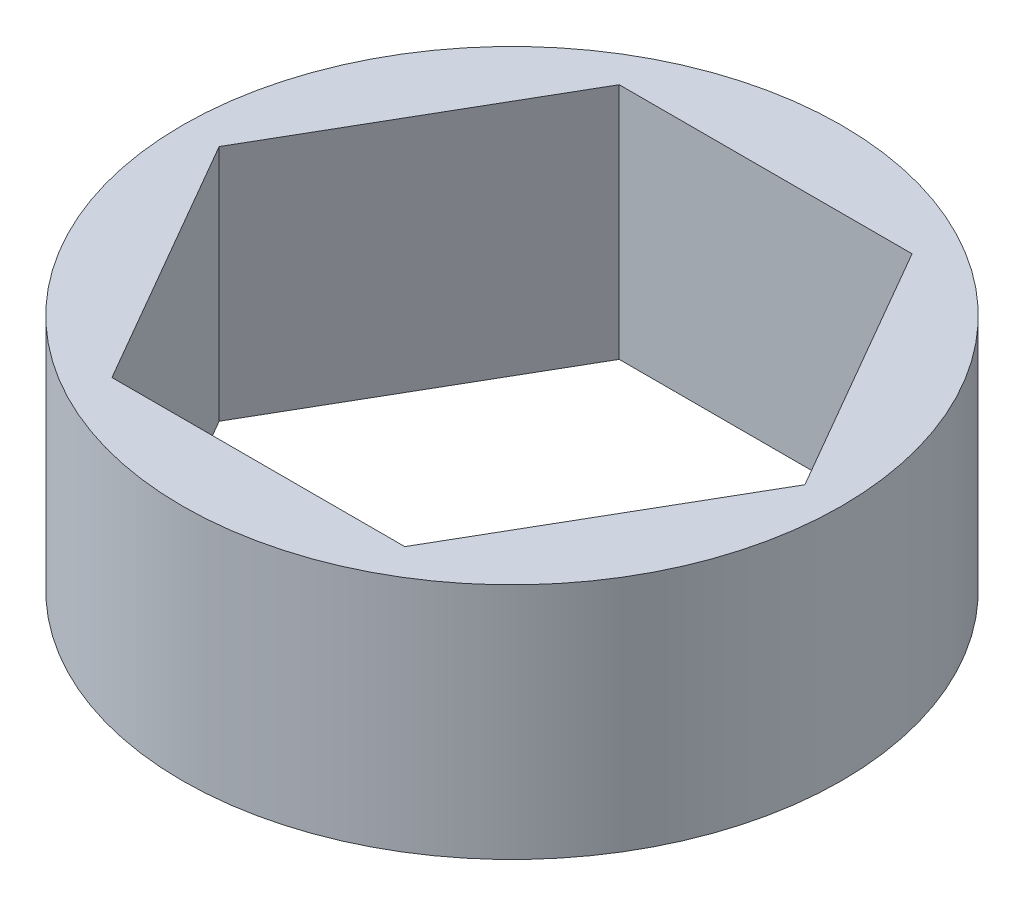
ISO-10303-21;
HEADER;
FILE_DESCRIPTION(('STEP AP214'),'2;1');
FILE_NAME('part.step','',(''),(''),'','','');
FILE_SCHEMA(('AUTOMOTIVE_DESIGN { 1 0 10303 214 1 1 1 1 }'));
ENDSEC;
DATA;
#1=APPLICATION_CONTEXT('core data for automotive mechanical design processes');
#2=APPLICATION_PROTOCOL_DEFINITION('international standard','automotive_design',2000,#1);
#3=PRODUCT_CONTEXT('',#1,'mechanical');
#4=PRODUCT('Part','Part','',(#3));
#5=PRODUCT_RELATED_PRODUCT_CATEGORY('part','',(#4));
#6=PRODUCT_DEFINITION_FORMATION('','',#4);
#7=PRODUCT_DEFINITION_CONTEXT('part definition',#1,'design');
#8=PRODUCT_DEFINITION('design','',#6,#7);
#9=PRODUCT_DEFINITION_SHAPE('','',#8);
#10=(LENGTH_UNIT() NAMED_UNIT(*) SI_UNIT(.MILLI.,.METRE.));
#11=(NAMED_UNIT(*) PLANE_ANGLE_UNIT() SI_UNIT($,.RADIAN.));
#12=(NAMED_UNIT(*) SI_UNIT($,.STERADIAN.) SOLID_ANGLE_UNIT());
#13=UNCERTAINTY_MEASURE_WITH_UNIT(LENGTH_MEASURE(1.E-05),#10,'distance_accuracy_value','');
#14=(GEOMETRIC_REPRESENTATION_CONTEXT(3) GLOBAL_UNCERTAINTY_ASSIGNED_CONTEXT((#13)) GLOBAL_UNIT_ASSIGNED_CONTEXT((#10,
#11,#12)) REPRESENTATION_CONTEXT('',''));
#15=CARTESIAN_POINT('',(0.,0.,0.));
#16=DIRECTION('',(0.,0.,1.));
#17=DIRECTION('',(1.,0.,0.));
#18=AXIS2_PLACEMENT_3D('',#15,#16,#17);
#19=CARTESIAN_POINT('',(0.,5.9563,0.));
#20=DIRECTION('',(0.,1.,0.));
#21=DIRECTION('',(0.,0.,1.));
#22=AXIS2_PLACEMENT_3D('',#19,#20,#21);
#23=PLANE('',#22);
#24=CARTESIAN_POINT('',(0.,5.9563,0.));
#25=DIRECTION('',(0.,1.,0.));
#26=DIRECTION('',(0.,0.,1.));
#27=AXIS2_PLACEMENT_3D('',#24,#25,#26);
#28=CIRCLE('',#27,8.255);
#29=CARTESIAN_POINT('',(0.,5.9563,8.255));
#30=VERTEX_POINT('',#29);
#31=EDGE_CURVE('E11',#30,#30,#28,.T.);
#32=ORIENTED_EDGE('',*,*,#31,.T.);
#33=EDGE_LOOP('',(#32));
#34=FACE_BOUND('',#33,.T.);
#35=DIRECTION('',(-0.5,0.,-0.866025403784439));
#36=VECTOR('',#35,1.);
#37=CARTESIAN_POINT('',(7.33234841870825,5.9563,0.));
#38=LINE('',#37,#36);
#39=CARTESIAN_POINT('',(7.33234841870825,5.9563,0.));
#40=VERTEX_POINT('',#39);
#41=CARTESIAN_POINT('',(3.66617420935412,5.9563,-6.35));
#42=VERTEX_POINT('',#41);
#43=EDGE_CURVE('E112',#40,#42,#38,.T.);
#44=ORIENTED_EDGE('',*,*,#43,.F.);
#45=DIRECTION('',(0.5,0.,-0.866025403784439));
#46=VECTOR('',#45,1.);
#47=CARTESIAN_POINT('',(3.66617420935413,5.9563,6.35));
#48=LINE('',#47,#46);
#49=CARTESIAN_POINT('',(3.66617420935413,5.9563,6.35));
#50=VERTEX_POINT('',#49);
#51=EDGE_CURVE('E103',#50,#40,#48,.T.);
#52=ORIENTED_EDGE('',*,*,#51,.F.);
#53=DIRECTION('',(1.,0.,0.));
#54=VECTOR('',#53,1.);
#55=CARTESIAN_POINT('',(-3.66617420935412,5.9563,6.35));
#56=LINE('',#55,#54);
#57=CARTESIAN_POINT('',(-3.66617420935412,5.9563,6.35));
#58=VERTEX_POINT('',#57);
#59=EDGE_CURVE('E137',#58,#50,#56,.T.);
#60=ORIENTED_EDGE('',*,*,#59,.F.);
#61=DIRECTION('',(0.5,0.,0.866025403784438));
#62=VECTOR('',#61,1.);
#63=CARTESIAN_POINT('',(-7.33234841870825,5.9563,0.));
#64=LINE('',#63,#62);
#65=CARTESIAN_POINT('',(-7.33234841870825,5.9563,0.));
#66=VERTEX_POINT('',#65);
#67=EDGE_CURVE('E134',#66,#58,#64,.T.);
#68=ORIENTED_EDGE('',*,*,#67,.F.);
#69=DIRECTION('',(-0.5,0.,0.866025403784439));
#70=VECTOR('',#69,1.);
#71=CARTESIAN_POINT('',(-3.66617420935412,5.9563,-6.35));
#72=LINE('',#71,#70);
#73=CARTESIAN_POINT('',(-3.66617420935412,5.9563,-6.35));
#74=VERTEX_POINT('',#73);
#75=EDGE_CURVE('E129',#74,#66,#72,.T.);
#76=ORIENTED_EDGE('',*,*,#75,.F.);
#77=DIRECTION('',(-1.,0.,0.));
#78=VECTOR('',#77,1.);
#79=CARTESIAN_POINT('',(3.66617420935412,5.9563,-6.35));
#80=LINE('',#79,#78);
#81=EDGE_CURVE('E125',#42,#74,#80,.T.);
#82=ORIENTED_EDGE('',*,*,#81,.F.);
#83=EDGE_LOOP('',(#44,#52,#60,#68,#76,#82));
#84=FACE_BOUND('',#83,.T.);
#85=ADVANCED_FACE('F49',(#34,#84),#23,.T.);
#86=CARTESIAN_POINT('',(0.,0.,0.));
#87=DIRECTION('',(0.,1.,0.));
#88=DIRECTION('',(0.,0.,1.));
#89=AXIS2_PLACEMENT_3D('',#86,#87,#88);
#90=PLANE('',#89);
#91=CARTESIAN_POINT('',(0.,0.,0.));
#92=DIRECTION('',(0.,1.,0.));
#93=DIRECTION('',(0.,0.,1.));
#94=AXIS2_PLACEMENT_3D('',#91,#92,#93);
#95=CIRCLE('',#94,8.255);
#96=CARTESIAN_POINT('',(0.,0.,8.255));
#97=VERTEX_POINT('',#96);
#98=EDGE_CURVE('E53',#97,#97,#95,.T.);
#99=ORIENTED_EDGE('',*,*,#98,.F.);
#100=EDGE_LOOP('',(#99));
#101=FACE_BOUND('',#100,.T.);
#102=DIRECTION('',(0.5,0.,-0.866025403784439));
#103=VECTOR('',#102,1.);
#104=CARTESIAN_POINT('',(3.66617420935413,0.,6.35));
#105=LINE('',#104,#103);
#106=CARTESIAN_POINT('',(3.66617420935413,0.,6.35));
#107=VERTEX_POINT('',#106);
#108=CARTESIAN_POINT('',(7.33234841870825,0.,0.));
#109=VERTEX_POINT('',#108);
#110=EDGE_CURVE('E73',#107,#109,#105,.T.);
#111=ORIENTED_EDGE('',*,*,#110,.T.);
#112=DIRECTION('',(-0.5,0.,-0.866025403784439));
#113=VECTOR('',#112,1.);
#114=CARTESIAN_POINT('',(7.33234841870825,0.,0.));
#115=LINE('',#114,#113);
#116=CARTESIAN_POINT('',(3.66617420935412,0.,-6.35));
#117=VERTEX_POINT('',#116);
#118=EDGE_CURVE('E119',#109,#117,#115,.T.);
#119=ORIENTED_EDGE('',*,*,#118,.T.);
#120=DIRECTION('',(-1.,0.,0.));
#121=VECTOR('',#120,1.);
#122=CARTESIAN_POINT('',(3.66617420935412,0.,-6.35));
#123=LINE('',#122,#121);
#124=CARTESIAN_POINT('',(-3.66617420935412,0.,-6.35));
#125=VERTEX_POINT('',#124);
#126=EDGE_CURVE('E144',#117,#125,#123,.T.);
#127=ORIENTED_EDGE('',*,*,#126,.T.);
#128=DIRECTION('',(-0.5,0.,0.866025403784439));
#129=VECTOR('',#128,1.);
#130=CARTESIAN_POINT('',(-3.66617420935412,0.,-6.35));
#131=LINE('',#130,#129);
#132=CARTESIAN_POINT('',(-7.33234841870825,0.,0.));
#133=VERTEX_POINT('',#132);
#134=EDGE_CURVE('E148',#125,#133,#131,.T.);
#135=ORIENTED_EDGE('',*,*,#134,.T.);
#136=DIRECTION('',(0.5,0.,0.866025403784438));
#137=VECTOR('',#136,1.);
#138=CARTESIAN_POINT('',(-7.33234841870825,0.,0.));
#139=LINE('',#138,#137);
#140=CARTESIAN_POINT('',(-3.66617420935412,0.,6.35));
#141=VERTEX_POINT('',#140);
#142=EDGE_CURVE('E152',#133,#141,#139,.T.);
#143=ORIENTED_EDGE('',*,*,#142,.T.);
#144=DIRECTION('',(1.,0.,0.));
#145=VECTOR('',#144,1.);
#146=CARTESIAN_POINT('',(-3.66617420935412,0.,6.35));
#147=LINE('',#146,#145);
#148=EDGE_CURVE('E113',#141,#107,#147,.T.);
#149=ORIENTED_EDGE('',*,*,#148,.T.);
#150=EDGE_LOOP('',(#111,#119,#127,#135,#143,#149));
#151=FACE_BOUND('',#150,.T.);
#152=ADVANCED_FACE('F176',(#101,#151),#90,.F.);
#153=CARTESIAN_POINT('',(0.,5.9563,0.));
#154=DIRECTION('',(0.,-1.,0.));
#155=DIRECTION('',(0.,0.,-1.));
#156=AXIS2_PLACEMENT_3D('',#153,#154,#155);
#157=CYLINDRICAL_SURFACE('',#156,8.255);
#158=ORIENTED_EDGE('',*,*,#31,.F.);
#159=EDGE_LOOP('',(#158));
#160=FACE_BOUND('',#159,.T.);
#161=ORIENTED_EDGE('',*,*,#98,.T.);
#162=EDGE_LOOP('',(#161));
#163=FACE_BOUND('',#162,.T.);
#164=ADVANCED_FACE('F51',(#160,#163),#157,.T.);
#165=CARTESIAN_POINT('',(3.66617420935413,5.9563,6.35));
#166=DIRECTION('',(-0.866025403784439,0.,-0.5));
#167=DIRECTION('',(-0.5,0.,0.866025403784439));
#168=AXIS2_PLACEMENT_3D('',#165,#166,#167);
#169=PLANE('',#168);
#170=ORIENTED_EDGE('',*,*,#110,.F.);
#171=DIRECTION('',(0.,-1.,0.));
#172=VECTOR('',#171,1.);
#173=CARTESIAN_POINT('',(3.66617420935413,5.9563,6.35));
#174=LINE('',#173,#172);
#175=EDGE_CURVE('E107',#50,#107,#174,.T.);
#176=ORIENTED_EDGE('',*,*,#175,.F.);
#177=ORIENTED_EDGE('',*,*,#51,.T.);
#178=DIRECTION('',(0.,-1.,0.));
#179=VECTOR('',#178,1.);
#180=CARTESIAN_POINT('',(7.33234841870825,5.9563,0.));
#181=LINE('',#180,#179);
#182=EDGE_CURVE('E106',#40,#109,#181,.T.);
#183=ORIENTED_EDGE('',*,*,#182,.T.);
#184=EDGE_LOOP('',(#170,#176,#177,#183));
#185=FACE_BOUND('',#184,.T.);
#186=ADVANCED_FACE('F105',(#185),#169,.T.);
#187=CARTESIAN_POINT('',(7.33234841870825,5.9563,0.));
#188=DIRECTION('',(-0.866025403784439,0.,0.5));
#189=DIRECTION('',(0.5,0.,0.866025403784439));
#190=AXIS2_PLACEMENT_3D('',#187,#188,#189);
#191=PLANE('',#190);
#192=ORIENTED_EDGE('',*,*,#118,.F.);
#193=ORIENTED_EDGE('',*,*,#182,.F.);
#194=ORIENTED_EDGE('',*,*,#43,.T.);
#195=DIRECTION('',(0.,-1.,0.));
#196=VECTOR('',#195,1.);
#197=CARTESIAN_POINT('',(3.66617420935412,5.9563,-6.35));
#198=LINE('',#197,#196);
#199=EDGE_CURVE('E121',#42,#117,#198,.T.);
#200=ORIENTED_EDGE('',*,*,#199,.T.);
#201=EDGE_LOOP('',(#192,#193,#194,#200));
#202=FACE_BOUND('',#201,.T.);
#203=ADVANCED_FACE('F116',(#202),#191,.T.);
#204=CARTESIAN_POINT('',(3.66617420935412,5.9563,-6.35));
#205=DIRECTION('',(0.,0.,1.));
#206=DIRECTION('',(1.,0.,0.));
#207=AXIS2_PLACEMENT_3D('',#204,#205,#206);
#208=PLANE('',#207);
#209=ORIENTED_EDGE('',*,*,#126,.F.);
#210=ORIENTED_EDGE('',*,*,#199,.F.);
#211=ORIENTED_EDGE('',*,*,#81,.T.);
#212=DIRECTION('',(0.,-1.,0.));
#213=VECTOR('',#212,1.);
#214=CARTESIAN_POINT('',(-3.66617420935412,5.9563,-6.35));
#215=LINE('',#214,#213);
#216=EDGE_CURVE('E166',#74,#125,#215,.T.);
#217=ORIENTED_EDGE('',*,*,#216,.T.);
#218=EDGE_LOOP('',(#209,#210,#211,#217));
#219=FACE_BOUND('',#218,.T.);
#220=ADVANCED_FACE('F172',(#219),#208,.T.);
#221=CARTESIAN_POINT('',(-3.66617420935412,5.9563,-6.35));
#222=DIRECTION('',(0.866025403784439,0.,0.5));
#223=DIRECTION('',(0.5,0.,-0.866025403784439));
#224=AXIS2_PLACEMENT_3D('',#221,#222,#223);
#225=PLANE('',#224);
#226=ORIENTED_EDGE('',*,*,#134,.F.);
#227=ORIENTED_EDGE('',*,*,#216,.F.);
#228=ORIENTED_EDGE('',*,*,#75,.T.);
#229=DIRECTION('',(0.,-1.,0.));
#230=VECTOR('',#229,1.);
#231=CARTESIAN_POINT('',(-7.33234841870825,5.9563,0.));
#232=LINE('',#231,#230);
#233=EDGE_CURVE('E163',#66,#133,#232,.T.);
#234=ORIENTED_EDGE('',*,*,#233,.T.);
#235=EDGE_LOOP('',(#226,#227,#228,#234));
#236=FACE_BOUND('',#235,.T.);
#237=ADVANCED_FACE('F184',(#236),#225,.T.);
#238=CARTESIAN_POINT('',(-7.33234841870825,5.9563,0.));
#239=DIRECTION('',(0.866025403784438,0.,-0.5));
#240=DIRECTION('',(-0.5,0.,-0.866025403784439));
#241=AXIS2_PLACEMENT_3D('',#238,#239,#240);
#242=PLANE('',#241);
#243=ORIENTED_EDGE('',*,*,#142,.F.);
#244=ORIENTED_EDGE('',*,*,#233,.F.);
#245=ORIENTED_EDGE('',*,*,#67,.T.);
#246=DIRECTION('',(0.,-1.,0.));
#247=VECTOR('',#246,1.);
#248=CARTESIAN_POINT('',(-3.66617420935412,5.9563,6.35));
#249=LINE('',#248,#247);
#250=EDGE_CURVE('E65',#58,#141,#249,.T.);
#251=ORIENTED_EDGE('',*,*,#250,.T.);
#252=EDGE_LOOP('',(#243,#244,#245,#251));
#253=FACE_BOUND('',#252,.T.);
#254=ADVANCED_FACE('F182',(#253),#242,.T.);
#255=CARTESIAN_POINT('',(-3.66617420935412,5.9563,6.35));
#256=DIRECTION('',(0.,0.,-1.));
#257=DIRECTION('',(-1.,0.,0.));
#258=AXIS2_PLACEMENT_3D('',#255,#256,#257);
#259=PLANE('',#258);
#260=ORIENTED_EDGE('',*,*,#148,.F.);
#261=ORIENTED_EDGE('',*,*,#250,.F.);
#262=ORIENTED_EDGE('',*,*,#59,.T.);
#263=ORIENTED_EDGE('',*,*,#175,.T.);
#264=EDGE_LOOP('',(#260,#261,#262,#263));
#265=FACE_BOUND('',#264,.T.);
#266=ADVANCED_FACE('F178',(#265),#259,.T.);
#267=CLOSED_SHELL('',(#85,#152,#164,#186,#203,#220,#237,#254,#266));
#268=MANIFOLD_SOLID_BREP('B2',#267);
#269=ADVANCED_BREP_SHAPE_REPRESENTATION('',(#18,#268),#14);
#270=SHAPE_DEFINITION_REPRESENTATION(#9,#269);
ENDSEC;
END-ISO-10303-21;
